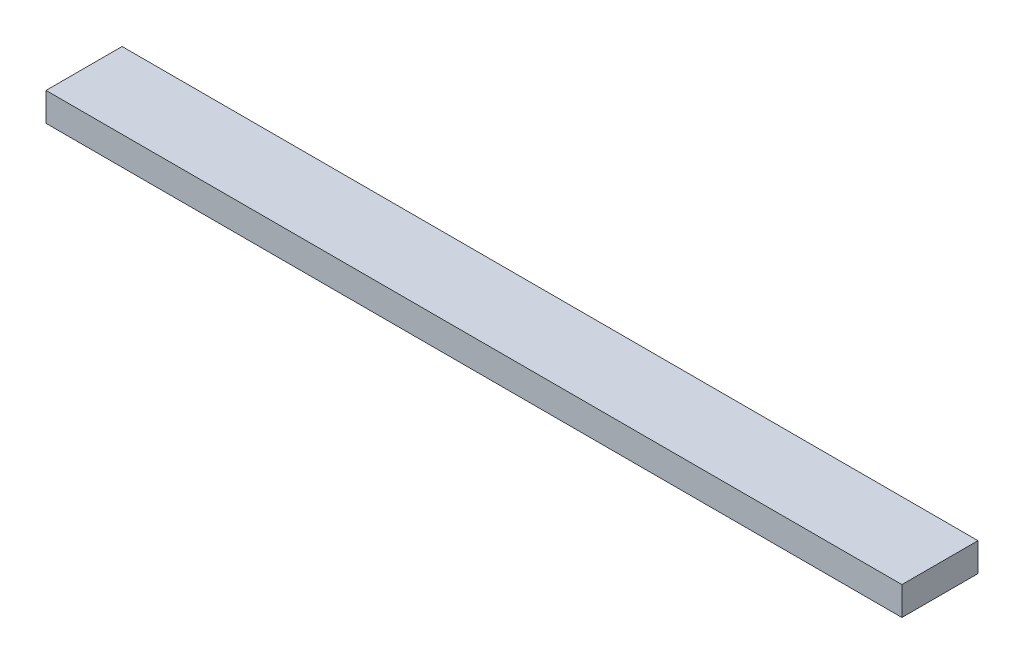
ISO-10303-21;
HEADER;
FILE_DESCRIPTION(('STEP AP214'),'2;1');
FILE_NAME('part.step','',(''),(''),'','','');
FILE_SCHEMA(('AUTOMOTIVE_DESIGN { 1 0 10303 214 1 1 1 1 }'));
ENDSEC;
DATA;
#1=APPLICATION_CONTEXT('core data for automotive mechanical design processes');
#2=APPLICATION_PROTOCOL_DEFINITION('international standard','automotive_design',2000,#1);
#3=PRODUCT_CONTEXT('',#1,'mechanical');
#4=PRODUCT('Part','Part','',(#3));
#5=PRODUCT_RELATED_PRODUCT_CATEGORY('part','',(#4));
#6=PRODUCT_DEFINITION_FORMATION('','',#4);
#7=PRODUCT_DEFINITION_CONTEXT('part definition',#1,'design');
#8=PRODUCT_DEFINITION('design','',#6,#7);
#9=PRODUCT_DEFINITION_SHAPE('','',#8);
#10=(LENGTH_UNIT() NAMED_UNIT(*) SI_UNIT(.MILLI.,.METRE.));
#11=(NAMED_UNIT(*) PLANE_ANGLE_UNIT() SI_UNIT($,.RADIAN.));
#12=(NAMED_UNIT(*) SI_UNIT($,.STERADIAN.) SOLID_ANGLE_UNIT());
#13=UNCERTAINTY_MEASURE_WITH_UNIT(LENGTH_MEASURE(1.E-05),#10,'distance_accuracy_value','');
#14=(GEOMETRIC_REPRESENTATION_CONTEXT(3) GLOBAL_UNCERTAINTY_ASSIGNED_CONTEXT((#13)) GLOBAL_UNIT_ASSIGNED_CONTEXT((#10,
#11,#12)) REPRESENTATION_CONTEXT('',''));
#15=CARTESIAN_POINT('',(0.,0.,0.));
#16=DIRECTION('',(0.,0.,1.));
#17=DIRECTION('',(1.,0.,0.));
#18=AXIS2_PLACEMENT_3D('',#15,#16,#17);
#19=CARTESIAN_POINT('',(-45.,3.,4.));
#20=DIRECTION('',(1.,0.,0.));
#21=DIRECTION('',(0.,0.,-1.));
#22=AXIS2_PLACEMENT_3D('',#19,#20,#21);
#23=PLANE('',#22);
#24=DIRECTION('',(0.,0.,1.));
#25=VECTOR('',#24,1.);
#26=CARTESIAN_POINT('',(-45.,0.,4.));
#27=LINE('',#26,#25);
#28=CARTESIAN_POINT('',(-45.,0.,-4.));
#29=VERTEX_POINT('',#28);
#30=CARTESIAN_POINT('',(-45.,0.,4.));
#31=VERTEX_POINT('',#30);
#32=EDGE_CURVE('E111',#29,#31,#27,.T.);
#33=ORIENTED_EDGE('',*,*,#32,.T.);
#34=DIRECTION('',(0.,-1.,0.));
#35=VECTOR('',#34,1.);
#36=CARTESIAN_POINT('',(-45.,3.,4.));
#37=LINE('',#36,#35);
#38=CARTESIAN_POINT('',(-45.,3.,4.));
#39=VERTEX_POINT('',#38);
#40=EDGE_CURVE('E11',#39,#31,#37,.T.);
#41=ORIENTED_EDGE('',*,*,#40,.F.);
#42=DIRECTION('',(0.,0.,1.));
#43=VECTOR('',#42,1.);
#44=CARTESIAN_POINT('',(-45.,3.,4.));
#45=LINE('',#44,#43);
#46=CARTESIAN_POINT('',(-45.,3.,-4.));
#47=VERTEX_POINT('',#46);
#48=EDGE_CURVE('E95',#47,#39,#45,.T.);
#49=ORIENTED_EDGE('',*,*,#48,.F.);
#50=DIRECTION('',(0.,-1.,0.));
#51=VECTOR('',#50,1.);
#52=CARTESIAN_POINT('',(-45.,3.,-4.));
#53=LINE('',#52,#51);
#54=EDGE_CURVE('E107',#47,#29,#53,.T.);
#55=ORIENTED_EDGE('',*,*,#54,.T.);
#56=EDGE_LOOP('',(#33,#41,#49,#55));
#57=FACE_BOUND('',#56,.T.);
#58=ADVANCED_FACE('F43',(#57),#23,.F.);
#59=CARTESIAN_POINT('',(45.,3.,3.99999999999999));
#60=DIRECTION('',(0.,0.,-1.));
#61=DIRECTION('',(-1.,0.,0.));
#62=AXIS2_PLACEMENT_3D('',#59,#60,#61);
#63=PLANE('',#62);
#64=DIRECTION('',(1.,0.,0.));
#65=VECTOR('',#64,1.);
#66=CARTESIAN_POINT('',(45.,0.,3.99999999999999));
#67=LINE('',#66,#65);
#68=CARTESIAN_POINT('',(45.,0.,3.99999999999999));
#69=VERTEX_POINT('',#68);
#70=EDGE_CURVE('E100',#31,#69,#67,.T.);
#71=ORIENTED_EDGE('',*,*,#70,.T.);
#72=DIRECTION('',(0.,-1.,0.));
#73=VECTOR('',#72,1.);
#74=CARTESIAN_POINT('',(45.,3.,3.99999999999999));
#75=LINE('',#74,#73);
#76=CARTESIAN_POINT('',(45.,3.,3.99999999999999));
#77=VERTEX_POINT('',#76);
#78=EDGE_CURVE('E52',#77,#69,#75,.T.);
#79=ORIENTED_EDGE('',*,*,#78,.F.);
#80=DIRECTION('',(1.,0.,0.));
#81=VECTOR('',#80,1.);
#82=CARTESIAN_POINT('',(45.,3.,3.99999999999999));
#83=LINE('',#82,#81);
#84=EDGE_CURVE('E90',#39,#77,#83,.T.);
#85=ORIENTED_EDGE('',*,*,#84,.F.);
#86=ORIENTED_EDGE('',*,*,#40,.T.);
#87=EDGE_LOOP('',(#71,#79,#85,#86));
#88=FACE_BOUND('',#87,.T.);
#89=ADVANCED_FACE('F99',(#88),#63,.F.);
#90=CARTESIAN_POINT('',(45.,3.,3.99999999999999));
#91=DIRECTION('',(-1.,0.,0.));
#92=DIRECTION('',(0.,0.,1.));
#93=AXIS2_PLACEMENT_3D('',#90,#91,#92);
#94=PLANE('',#93);
#95=DIRECTION('',(0.,0.,-1.));
#96=VECTOR('',#95,1.);
#97=CARTESIAN_POINT('',(45.,0.,3.99999999999999));
#98=LINE('',#97,#96);
#99=CARTESIAN_POINT('',(45.,0.,-4.00000000000001));
#100=VERTEX_POINT('',#99);
#101=EDGE_CURVE('E77',#69,#100,#98,.T.);
#102=ORIENTED_EDGE('',*,*,#101,.T.);
#103=DIRECTION('',(0.,-1.,0.));
#104=VECTOR('',#103,1.);
#105=CARTESIAN_POINT('',(45.,3.,-4.00000000000001));
#106=LINE('',#105,#104);
#107=CARTESIAN_POINT('',(45.,3.,-4.00000000000001));
#108=VERTEX_POINT('',#107);
#109=EDGE_CURVE('E102',#108,#100,#106,.T.);
#110=ORIENTED_EDGE('',*,*,#109,.F.);
#111=DIRECTION('',(0.,0.,-1.));
#112=VECTOR('',#111,1.);
#113=CARTESIAN_POINT('',(45.,3.,3.99999999999999));
#114=LINE('',#113,#112);
#115=EDGE_CURVE('E93',#77,#108,#114,.T.);
#116=ORIENTED_EDGE('',*,*,#115,.F.);
#117=ORIENTED_EDGE('',*,*,#78,.T.);
#118=EDGE_LOOP('',(#102,#110,#116,#117));
#119=FACE_BOUND('',#118,.T.);
#120=ADVANCED_FACE('F103',(#119),#94,.F.);
#121=CARTESIAN_POINT('',(45.,3.,-4.00000000000001));
#122=DIRECTION('',(0.,0.,1.));
#123=DIRECTION('',(1.,0.,0.));
#124=AXIS2_PLACEMENT_3D('',#121,#122,#123);
#125=PLANE('',#124);
#126=DIRECTION('',(-1.,0.,0.));
#127=VECTOR('',#126,1.);
#128=CARTESIAN_POINT('',(45.,0.,-4.00000000000001));
#129=LINE('',#128,#127);
#130=EDGE_CURVE('E83',#100,#29,#129,.T.);
#131=ORIENTED_EDGE('',*,*,#130,.T.);
#132=ORIENTED_EDGE('',*,*,#54,.F.);
#133=DIRECTION('',(-1.,0.,0.));
#134=VECTOR('',#133,1.);
#135=CARTESIAN_POINT('',(45.,3.,-4.00000000000001));
#136=LINE('',#135,#134);
#137=EDGE_CURVE('E60',#108,#47,#136,.T.);
#138=ORIENTED_EDGE('',*,*,#137,.F.);
#139=ORIENTED_EDGE('',*,*,#109,.T.);
#140=EDGE_LOOP('',(#131,#132,#138,#139));
#141=FACE_BOUND('',#140,.T.);
#142=ADVANCED_FACE('F124',(#141),#125,.F.);
#143=CARTESIAN_POINT('',(0.,3.,0.));
#144=DIRECTION('',(0.,1.,0.));
#145=DIRECTION('',(0.,0.,1.));
#146=AXIS2_PLACEMENT_3D('',#143,#144,#145);
#147=PLANE('',#146);
#148=ORIENTED_EDGE('',*,*,#48,.T.);
#149=ORIENTED_EDGE('',*,*,#84,.T.);
#150=ORIENTED_EDGE('',*,*,#115,.T.);
#151=ORIENTED_EDGE('',*,*,#137,.T.);
#152=EDGE_LOOP('',(#148,#149,#150,#151));
#153=FACE_BOUND('',#152,.T.);
#154=ADVANCED_FACE('F91',(#153),#147,.T.);
#155=CARTESIAN_POINT('',(0.,0.,0.));
#156=DIRECTION('',(0.,1.,0.));
#157=DIRECTION('',(0.,0.,1.));
#158=AXIS2_PLACEMENT_3D('',#155,#156,#157);
#159=PLANE('',#158);
#160=ORIENTED_EDGE('',*,*,#32,.F.);
#161=ORIENTED_EDGE('',*,*,#130,.F.);
#162=ORIENTED_EDGE('',*,*,#101,.F.);
#163=ORIENTED_EDGE('',*,*,#70,.F.);
#164=EDGE_LOOP('',(#160,#161,#162,#163));
#165=FACE_BOUND('',#164,.T.);
#166=ADVANCED_FACE('F127',(#165),#159,.F.);
#167=CLOSED_SHELL('',(#58,#89,#120,#142,#154,#166));
#168=MANIFOLD_SOLID_BREP('B2',#167);
#169=ADVANCED_BREP_SHAPE_REPRESENTATION('',(#18,#168),#14);
#170=SHAPE_DEFINITION_REPRESENTATION(#9,#169);
ENDSEC;
END-ISO-10303-21;
